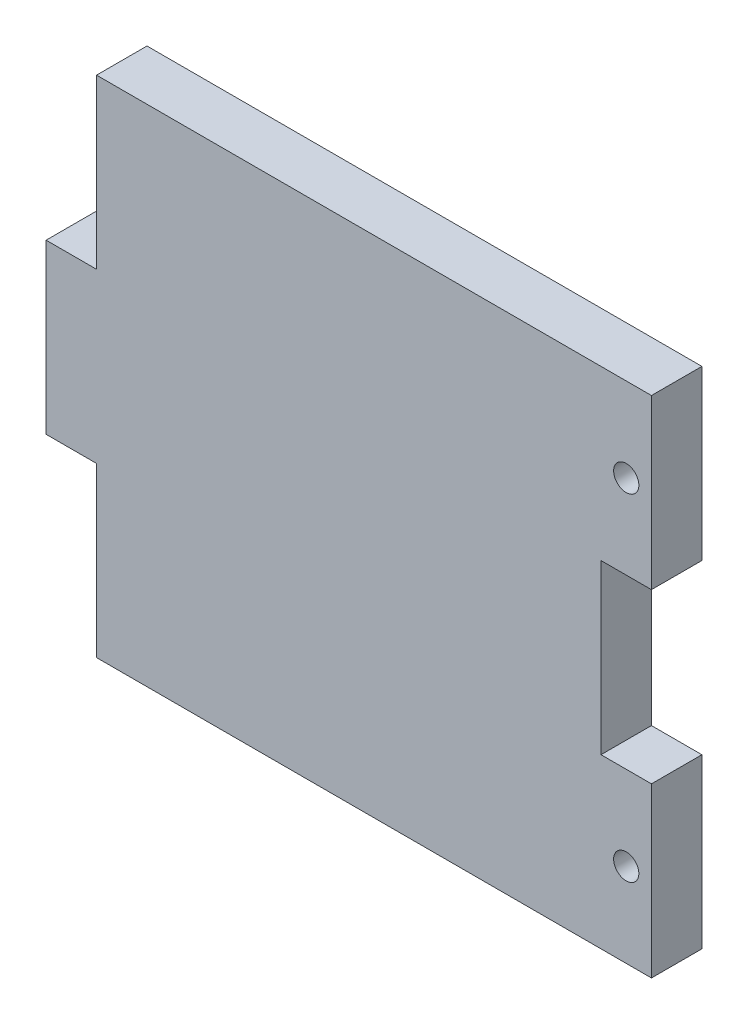
ISO-10303-21;
HEADER;
FILE_DESCRIPTION(('STEP AP214'),'2;1');
FILE_NAME('part.step','',(''),(''),'','','');
FILE_SCHEMA(('AUTOMOTIVE_DESIGN { 1 0 10303 214 1 1 1 1 }'));
ENDSEC;
DATA;
#1=APPLICATION_CONTEXT('core data for automotive mechanical design processes');
#2=APPLICATION_PROTOCOL_DEFINITION('international standard','automotive_design',2000,#1);
#3=PRODUCT_CONTEXT('',#1,'mechanical');
#4=PRODUCT('Part','Part','',(#3));
#5=PRODUCT_RELATED_PRODUCT_CATEGORY('part','',(#4));
#6=PRODUCT_DEFINITION_FORMATION('','',#4);
#7=PRODUCT_DEFINITION_CONTEXT('part definition',#1,'design');
#8=PRODUCT_DEFINITION('design','',#6,#7);
#9=PRODUCT_DEFINITION_SHAPE('','',#8);
#10=(LENGTH_UNIT() NAMED_UNIT(*) SI_UNIT(.MILLI.,.METRE.));
#11=(NAMED_UNIT(*) PLANE_ANGLE_UNIT() SI_UNIT($,.RADIAN.));
#12=(NAMED_UNIT(*) SI_UNIT($,.STERADIAN.) SOLID_ANGLE_UNIT());
#13=UNCERTAINTY_MEASURE_WITH_UNIT(LENGTH_MEASURE(1.E-05),#10,'distance_accuracy_value','');
#14=(GEOMETRIC_REPRESENTATION_CONTEXT(3) GLOBAL_UNCERTAINTY_ASSIGNED_CONTEXT((#13)) GLOBAL_UNIT_ASSIGNED_CONTEXT((#10,
#11,#12)) REPRESENTATION_CONTEXT('',''));
#15=CARTESIAN_POINT('',(0.,0.,0.));
#16=DIRECTION('',(0.,0.,1.));
#17=DIRECTION('',(1.,0.,0.));
#18=AXIS2_PLACEMENT_3D('',#15,#16,#17);
#19=CARTESIAN_POINT('',(0.,0.,6.));
#20=DIRECTION('',(-1.,0.,0.));
#21=DIRECTION('',(0.,-1.,0.));
#22=AXIS2_PLACEMENT_3D('',#19,#20,#21);
#23=PLANE('',#22);
#24=DIRECTION('',(0.,1.,0.));
#25=VECTOR('',#24,1.);
#26=CARTESIAN_POINT('',(0.,0.,0.));
#27=LINE('',#26,#25);
#28=CARTESIAN_POINT('',(0.,0.,0.));
#29=VERTEX_POINT('',#28);
#30=CARTESIAN_POINT('',(0.,20.,0.));
#31=VERTEX_POINT('',#30);
#32=EDGE_CURVE('E153',#29,#31,#27,.T.);
#33=ORIENTED_EDGE('',*,*,#32,.T.);
#34=DIRECTION('',(0.,0.,-1.));
#35=VECTOR('',#34,1.);
#36=CARTESIAN_POINT('',(0.,20.,6.));
#37=LINE('',#36,#35);
#38=CARTESIAN_POINT('',(0.,20.,6.));
#39=VERTEX_POINT('',#38);
#40=EDGE_CURVE('E11',#39,#31,#37,.T.);
#41=ORIENTED_EDGE('',*,*,#40,.F.);
#42=DIRECTION('',(0.,1.,0.));
#43=VECTOR('',#42,1.);
#44=CARTESIAN_POINT('',(0.,0.,6.));
#45=LINE('',#44,#43);
#46=CARTESIAN_POINT('',(0.,0.,6.));
#47=VERTEX_POINT('',#46);
#48=EDGE_CURVE('E176',#47,#39,#45,.T.);
#49=ORIENTED_EDGE('',*,*,#48,.F.);
#50=DIRECTION('',(0.,0.,-1.));
#51=VECTOR('',#50,1.);
#52=CARTESIAN_POINT('',(0.,0.,6.));
#53=LINE('',#52,#51);
#54=EDGE_CURVE('E149',#47,#29,#53,.T.);
#55=ORIENTED_EDGE('',*,*,#54,.T.);
#56=EDGE_LOOP('',(#33,#41,#49,#55));
#57=FACE_BOUND('',#56,.T.);
#58=ADVANCED_FACE('F33',(#57),#23,.F.);
#59=CARTESIAN_POINT('',(0.,20.,6.));
#60=DIRECTION('',(0.,-1.,0.));
#61=DIRECTION('',(1.,0.,0.));
#62=AXIS2_PLACEMENT_3D('',#59,#60,#61);
#63=PLANE('',#62);
#64=DIRECTION('',(-1.,0.,0.));
#65=VECTOR('',#64,1.);
#66=CARTESIAN_POINT('',(0.,20.,0.));
#67=LINE('',#66,#65);
#68=CARTESIAN_POINT('',(-6.,20.,0.));
#69=VERTEX_POINT('',#68);
#70=EDGE_CURVE('E156',#31,#69,#67,.T.);
#71=ORIENTED_EDGE('',*,*,#70,.T.);
#72=DIRECTION('',(0.,0.,-1.));
#73=VECTOR('',#72,1.);
#74=CARTESIAN_POINT('',(-6.,20.,6.));
#75=LINE('',#74,#73);
#76=CARTESIAN_POINT('',(-6.,20.,6.));
#77=VERTEX_POINT('',#76);
#78=EDGE_CURVE('E41',#77,#69,#75,.T.);
#79=ORIENTED_EDGE('',*,*,#78,.F.);
#80=DIRECTION('',(-1.,0.,0.));
#81=VECTOR('',#80,1.);
#82=CARTESIAN_POINT('',(0.,20.,6.));
#83=LINE('',#82,#81);
#84=EDGE_CURVE('E104',#39,#77,#83,.T.);
#85=ORIENTED_EDGE('',*,*,#84,.F.);
#86=ORIENTED_EDGE('',*,*,#40,.T.);
#87=EDGE_LOOP('',(#71,#79,#85,#86));
#88=FACE_BOUND('',#87,.T.);
#89=ADVANCED_FACE('F255',(#88),#63,.F.);
#90=CARTESIAN_POINT('',(-6.,40.,6.));
#91=DIRECTION('',(-1.,0.,0.));
#92=DIRECTION('',(0.,-1.,0.));
#93=AXIS2_PLACEMENT_3D('',#90,#91,#92);
#94=PLANE('',#93);
#95=DIRECTION('',(0.,1.,0.));
#96=VECTOR('',#95,1.);
#97=CARTESIAN_POINT('',(-6.,40.,0.));
#98=LINE('',#97,#96);
#99=CARTESIAN_POINT('',(-6.,40.,0.));
#100=VERTEX_POINT('',#99);
#101=EDGE_CURVE('E159',#69,#100,#98,.T.);
#102=ORIENTED_EDGE('',*,*,#101,.T.);
#103=DIRECTION('',(0.,0.,-1.));
#104=VECTOR('',#103,1.);
#105=CARTESIAN_POINT('',(-6.,40.,6.));
#106=LINE('',#105,#104);
#107=CARTESIAN_POINT('',(-6.,40.,6.));
#108=VERTEX_POINT('',#107);
#109=EDGE_CURVE('E195',#108,#100,#106,.T.);
#110=ORIENTED_EDGE('',*,*,#109,.F.);
#111=DIRECTION('',(0.,1.,0.));
#112=VECTOR('',#111,1.);
#113=CARTESIAN_POINT('',(-6.,40.,6.));
#114=LINE('',#113,#112);
#115=EDGE_CURVE('E203',#77,#108,#114,.T.);
#116=ORIENTED_EDGE('',*,*,#115,.F.);
#117=ORIENTED_EDGE('',*,*,#78,.T.);
#118=EDGE_LOOP('',(#102,#110,#116,#117));
#119=FACE_BOUND('',#118,.T.);
#120=ADVANCED_FACE('F201',(#119),#94,.F.);
#121=CARTESIAN_POINT('',(0.,40.,6.));
#122=DIRECTION('',(0.,1.,0.));
#123=DIRECTION('',(-1.,0.,0.));
#124=AXIS2_PLACEMENT_3D('',#121,#122,#123);
#125=PLANE('',#124);
#126=DIRECTION('',(1.,0.,0.));
#127=VECTOR('',#126,1.);
#128=CARTESIAN_POINT('',(0.,40.,0.));
#129=LINE('',#128,#127);
#130=CARTESIAN_POINT('',(0.,40.,0.));
#131=VERTEX_POINT('',#130);
#132=EDGE_CURVE('E161',#100,#131,#129,.T.);
#133=ORIENTED_EDGE('',*,*,#132,.T.);
#134=DIRECTION('',(0.,0.,-1.));
#135=VECTOR('',#134,1.);
#136=CARTESIAN_POINT('',(0.,40.,6.));
#137=LINE('',#136,#135);
#138=CARTESIAN_POINT('',(0.,40.,6.));
#139=VERTEX_POINT('',#138);
#140=EDGE_CURVE('E192',#139,#131,#137,.T.);
#141=ORIENTED_EDGE('',*,*,#140,.F.);
#142=DIRECTION('',(1.,0.,0.));
#143=VECTOR('',#142,1.);
#144=CARTESIAN_POINT('',(0.,40.,6.));
#145=LINE('',#144,#143);
#146=EDGE_CURVE('E221',#108,#139,#145,.T.);
#147=ORIENTED_EDGE('',*,*,#146,.F.);
#148=ORIENTED_EDGE('',*,*,#109,.T.);
#149=EDGE_LOOP('',(#133,#141,#147,#148));
#150=FACE_BOUND('',#149,.T.);
#151=ADVANCED_FACE('F212',(#150),#125,.F.);
#152=CARTESIAN_POINT('',(0.,40.,6.));
#153=DIRECTION('',(-1.,0.,0.));
#154=DIRECTION('',(0.,0.,1.));
#155=AXIS2_PLACEMENT_3D('',#152,#153,#154);
#156=PLANE('',#155);
#157=DIRECTION('',(0.,1.,0.));
#158=VECTOR('',#157,1.);
#159=CARTESIAN_POINT('',(0.,40.,0.));
#160=LINE('',#159,#158);
#161=CARTESIAN_POINT('',(0.,60.,0.));
#162=VERTEX_POINT('',#161);
#163=EDGE_CURVE('E163',#131,#162,#160,.T.);
#164=ORIENTED_EDGE('',*,*,#163,.T.);
#165=DIRECTION('',(0.,0.,-1.));
#166=VECTOR('',#165,1.);
#167=CARTESIAN_POINT('',(0.,60.,6.));
#168=LINE('',#167,#166);
#169=CARTESIAN_POINT('',(0.,60.,6.));
#170=VERTEX_POINT('',#169);
#171=EDGE_CURVE('E189',#170,#162,#168,.T.);
#172=ORIENTED_EDGE('',*,*,#171,.F.);
#173=DIRECTION('',(0.,1.,0.));
#174=VECTOR('',#173,1.);
#175=CARTESIAN_POINT('',(0.,40.,6.));
#176=LINE('',#175,#174);
#177=EDGE_CURVE('E218',#139,#170,#176,.T.);
#178=ORIENTED_EDGE('',*,*,#177,.F.);
#179=ORIENTED_EDGE('',*,*,#140,.T.);
#180=EDGE_LOOP('',(#164,#172,#178,#179));
#181=FACE_BOUND('',#180,.T.);
#182=ADVANCED_FACE('F216',(#181),#156,.F.);
#183=CARTESIAN_POINT('',(0.,60.,6.));
#184=DIRECTION('',(0.,-1.,0.));
#185=DIRECTION('',(1.,0.,0.));
#186=AXIS2_PLACEMENT_3D('',#183,#184,#185);
#187=PLANE('',#186);
#188=DIRECTION('',(-1.,0.,0.));
#189=VECTOR('',#188,1.);
#190=CARTESIAN_POINT('',(0.,60.,0.));
#191=LINE('',#190,#189);
#192=CARTESIAN_POINT('',(-66.,60.,0.));
#193=VERTEX_POINT('',#192);
#194=EDGE_CURVE('E165',#162,#193,#191,.T.);
#195=ORIENTED_EDGE('',*,*,#194,.T.);
#196=DIRECTION('',(0.,0.,-1.));
#197=VECTOR('',#196,1.);
#198=CARTESIAN_POINT('',(-66.,60.,6.));
#199=LINE('',#198,#197);
#200=CARTESIAN_POINT('',(-66.,60.,6.));
#201=VERTEX_POINT('',#200);
#202=EDGE_CURVE('E186',#201,#193,#199,.T.);
#203=ORIENTED_EDGE('',*,*,#202,.F.);
#204=DIRECTION('',(-1.,0.,0.));
#205=VECTOR('',#204,1.);
#206=CARTESIAN_POINT('',(0.,60.,6.));
#207=LINE('',#206,#205);
#208=EDGE_CURVE('E220',#170,#201,#207,.T.);
#209=ORIENTED_EDGE('',*,*,#208,.F.);
#210=ORIENTED_EDGE('',*,*,#171,.T.);
#211=EDGE_LOOP('',(#195,#203,#209,#210));
#212=FACE_BOUND('',#211,.T.);
#213=ADVANCED_FACE('F268',(#212),#187,.F.);
#214=CARTESIAN_POINT('',(-66.,40.,6.));
#215=DIRECTION('',(1.,0.,0.));
#216=DIRECTION('',(0.,0.,-1.));
#217=AXIS2_PLACEMENT_3D('',#214,#215,#216);
#218=PLANE('',#217);
#219=DIRECTION('',(0.,-1.,0.));
#220=VECTOR('',#219,1.);
#221=CARTESIAN_POINT('',(-66.,40.,0.));
#222=LINE('',#221,#220);
#223=CARTESIAN_POINT('',(-66.,40.,0.));
#224=VERTEX_POINT('',#223);
#225=EDGE_CURVE('E167',#193,#224,#222,.T.);
#226=ORIENTED_EDGE('',*,*,#225,.T.);
#227=DIRECTION('',(0.,0.,-1.));
#228=VECTOR('',#227,1.);
#229=CARTESIAN_POINT('',(-66.,40.,6.));
#230=LINE('',#229,#228);
#231=CARTESIAN_POINT('',(-66.,40.,6.));
#232=VERTEX_POINT('',#231);
#233=EDGE_CURVE('E183',#232,#224,#230,.T.);
#234=ORIENTED_EDGE('',*,*,#233,.F.);
#235=DIRECTION('',(0.,-1.,0.));
#236=VECTOR('',#235,1.);
#237=CARTESIAN_POINT('',(-66.,40.,6.));
#238=LINE('',#237,#236);
#239=EDGE_CURVE('E223',#201,#232,#238,.T.);
#240=ORIENTED_EDGE('',*,*,#239,.F.);
#241=ORIENTED_EDGE('',*,*,#202,.T.);
#242=EDGE_LOOP('',(#226,#234,#240,#241));
#243=FACE_BOUND('',#242,.T.);
#244=ADVANCED_FACE('F271',(#243),#218,.F.);
#245=CARTESIAN_POINT('',(-66.,40.,6.));
#246=DIRECTION('',(0.,-1.,0.));
#247=DIRECTION('',(0.,0.,-1.));
#248=AXIS2_PLACEMENT_3D('',#245,#246,#247);
#249=PLANE('',#248);
#250=DIRECTION('',(-1.,0.,0.));
#251=VECTOR('',#250,1.);
#252=CARTESIAN_POINT('',(-66.,40.,0.));
#253=LINE('',#252,#251);
#254=CARTESIAN_POINT('',(-72.,40.,0.));
#255=VERTEX_POINT('',#254);
#256=EDGE_CURVE('E169',#224,#255,#253,.T.);
#257=ORIENTED_EDGE('',*,*,#256,.T.);
#258=DIRECTION('',(0.,0.,-1.));
#259=VECTOR('',#258,1.);
#260=CARTESIAN_POINT('',(-72.,40.,6.));
#261=LINE('',#260,#259);
#262=CARTESIAN_POINT('',(-72.,40.,6.));
#263=VERTEX_POINT('',#262);
#264=EDGE_CURVE('E180',#263,#255,#261,.T.);
#265=ORIENTED_EDGE('',*,*,#264,.F.);
#266=DIRECTION('',(-1.,0.,0.));
#267=VECTOR('',#266,1.);
#268=CARTESIAN_POINT('',(-66.,40.,6.));
#269=LINE('',#268,#267);
#270=EDGE_CURVE('E229',#232,#263,#269,.T.);
#271=ORIENTED_EDGE('',*,*,#270,.F.);
#272=ORIENTED_EDGE('',*,*,#233,.T.);
#273=EDGE_LOOP('',(#257,#265,#271,#272));
#274=FACE_BOUND('',#273,.T.);
#275=ADVANCED_FACE('F235',(#274),#249,.F.);
#276=CARTESIAN_POINT('',(-72.,40.,6.));
#277=DIRECTION('',(1.,0.,0.));
#278=DIRECTION('',(0.,0.,-1.));
#279=AXIS2_PLACEMENT_3D('',#276,#277,#278);
#280=PLANE('',#279);
#281=DIRECTION('',(0.,-1.,0.));
#282=VECTOR('',#281,1.);
#283=CARTESIAN_POINT('',(-72.,40.,0.));
#284=LINE('',#283,#282);
#285=CARTESIAN_POINT('',(-72.,20.,0.));
#286=VERTEX_POINT('',#285);
#287=EDGE_CURVE('E171',#255,#286,#284,.T.);
#288=ORIENTED_EDGE('',*,*,#287,.T.);
#289=DIRECTION('',(0.,0.,-1.));
#290=VECTOR('',#289,1.);
#291=CARTESIAN_POINT('',(-72.,20.,6.));
#292=LINE('',#291,#290);
#293=CARTESIAN_POINT('',(-72.,20.,6.));
#294=VERTEX_POINT('',#293);
#295=EDGE_CURVE('E144',#294,#286,#292,.T.);
#296=ORIENTED_EDGE('',*,*,#295,.F.);
#297=DIRECTION('',(0.,-1.,0.));
#298=VECTOR('',#297,1.);
#299=CARTESIAN_POINT('',(-72.,40.,6.));
#300=LINE('',#299,#298);
#301=EDGE_CURVE('E135',#263,#294,#300,.T.);
#302=ORIENTED_EDGE('',*,*,#301,.F.);
#303=ORIENTED_EDGE('',*,*,#264,.T.);
#304=EDGE_LOOP('',(#288,#296,#302,#303));
#305=FACE_BOUND('',#304,.T.);
#306=ADVANCED_FACE('F239',(#305),#280,.F.);
#307=CARTESIAN_POINT('',(-66.,20.,6.));
#308=DIRECTION('',(0.,1.,0.));
#309=DIRECTION('',(0.,0.,1.));
#310=AXIS2_PLACEMENT_3D('',#307,#308,#309);
#311=PLANE('',#310);
#312=DIRECTION('',(1.,0.,0.));
#313=VECTOR('',#312,1.);
#314=CARTESIAN_POINT('',(-66.,20.,0.));
#315=LINE('',#314,#313);
#316=CARTESIAN_POINT('',(-66.,20.,0.));
#317=VERTEX_POINT('',#316);
#318=EDGE_CURVE('E143',#286,#317,#315,.T.);
#319=ORIENTED_EDGE('',*,*,#318,.T.);
#320=DIRECTION('',(0.,0.,-1.));
#321=VECTOR('',#320,1.);
#322=CARTESIAN_POINT('',(-66.,20.,6.));
#323=LINE('',#322,#321);
#324=CARTESIAN_POINT('',(-66.,20.,6.));
#325=VERTEX_POINT('',#324);
#326=EDGE_CURVE('E140',#325,#317,#323,.T.);
#327=ORIENTED_EDGE('',*,*,#326,.F.);
#328=DIRECTION('',(1.,0.,0.));
#329=VECTOR('',#328,1.);
#330=CARTESIAN_POINT('',(-66.,20.,6.));
#331=LINE('',#330,#329);
#332=EDGE_CURVE('E129',#294,#325,#331,.T.);
#333=ORIENTED_EDGE('',*,*,#332,.F.);
#334=ORIENTED_EDGE('',*,*,#295,.T.);
#335=EDGE_LOOP('',(#319,#327,#333,#334));
#336=FACE_BOUND('',#335,.T.);
#337=ADVANCED_FACE('F141',(#336),#311,.F.);
#338=CARTESIAN_POINT('',(-66.,0.,6.));
#339=DIRECTION('',(1.,0.,0.));
#340=DIRECTION('',(0.,0.,-1.));
#341=AXIS2_PLACEMENT_3D('',#338,#339,#340);
#342=PLANE('',#341);
#343=DIRECTION('',(0.,-1.,0.));
#344=VECTOR('',#343,1.);
#345=CARTESIAN_POINT('',(-66.,0.,0.));
#346=LINE('',#345,#344);
#347=CARTESIAN_POINT('',(-66.,0.,0.));
#348=VERTEX_POINT('',#347);
#349=EDGE_CURVE('E90',#317,#348,#346,.T.);
#350=ORIENTED_EDGE('',*,*,#349,.T.);
#351=DIRECTION('',(0.,0.,-1.));
#352=VECTOR('',#351,1.);
#353=CARTESIAN_POINT('',(-66.,0.,6.));
#354=LINE('',#353,#352);
#355=CARTESIAN_POINT('',(-66.,0.,6.));
#356=VERTEX_POINT('',#355);
#357=EDGE_CURVE('E145',#356,#348,#354,.T.);
#358=ORIENTED_EDGE('',*,*,#357,.F.);
#359=DIRECTION('',(0.,-1.,0.));
#360=VECTOR('',#359,1.);
#361=CARTESIAN_POINT('',(-66.,0.,6.));
#362=LINE('',#361,#360);
#363=EDGE_CURVE('E133',#325,#356,#362,.T.);
#364=ORIENTED_EDGE('',*,*,#363,.F.);
#365=ORIENTED_EDGE('',*,*,#326,.T.);
#366=EDGE_LOOP('',(#350,#358,#364,#365));
#367=FACE_BOUND('',#366,.T.);
#368=ADVANCED_FACE('F147',(#367),#342,.F.);
#369=CARTESIAN_POINT('',(0.,0.,6.));
#370=DIRECTION('',(0.,1.,0.));
#371=DIRECTION('',(-1.,0.,0.));
#372=AXIS2_PLACEMENT_3D('',#369,#370,#371);
#373=PLANE('',#372);
#374=DIRECTION('',(1.,0.,0.));
#375=VECTOR('',#374,1.);
#376=CARTESIAN_POINT('',(0.,0.,0.));
#377=LINE('',#376,#375);
#378=EDGE_CURVE('E96',#348,#29,#377,.T.);
#379=ORIENTED_EDGE('',*,*,#378,.T.);
#380=ORIENTED_EDGE('',*,*,#54,.F.);
#381=DIRECTION('',(1.,0.,0.));
#382=VECTOR('',#381,1.);
#383=CARTESIAN_POINT('',(0.,0.,6.));
#384=LINE('',#383,#382);
#385=EDGE_CURVE('E49',#356,#47,#384,.T.);
#386=ORIENTED_EDGE('',*,*,#385,.F.);
#387=ORIENTED_EDGE('',*,*,#357,.T.);
#388=EDGE_LOOP('',(#379,#380,#386,#387));
#389=FACE_BOUND('',#388,.T.);
#390=ADVANCED_FACE('F243',(#389),#373,.F.);
#391=CARTESIAN_POINT('',(0.,0.,6.));
#392=DIRECTION('',(0.,0.,1.));
#393=DIRECTION('',(1.,0.,0.));
#394=AXIS2_PLACEMENT_3D('',#391,#392,#393);
#395=PLANE('',#394);
#396=CARTESIAN_POINT('',(-3.,9.99999999999998,6.));
#397=DIRECTION('',(0.,0.,-1.));
#398=DIRECTION('',(-1.,0.,0.));
#399=AXIS2_PLACEMENT_3D('',#396,#397,#398);
#400=CIRCLE('',#399,1.5);
#401=CARTESIAN_POINT('',(-4.5,9.99999999999998,6.));
#402=VERTEX_POINT('',#401);
#403=EDGE_CURVE('E334',#402,#402,#400,.T.);
#404=ORIENTED_EDGE('',*,*,#403,.T.);
#405=EDGE_LOOP('',(#404));
#406=FACE_BOUND('',#405,.T.);
#407=CARTESIAN_POINT('',(-3.,50.,6.));
#408=DIRECTION('',(0.,0.,-1.));
#409=DIRECTION('',(1.,0.,0.));
#410=AXIS2_PLACEMENT_3D('',#407,#408,#409);
#411=CIRCLE('',#410,1.5);
#412=CARTESIAN_POINT('',(-1.5,50.,6.));
#413=VERTEX_POINT('',#412);
#414=EDGE_CURVE('E157',#413,#413,#411,.T.);
#415=ORIENTED_EDGE('',*,*,#414,.T.);
#416=EDGE_LOOP('',(#415));
#417=FACE_BOUND('',#416,.T.);
#418=ORIENTED_EDGE('',*,*,#48,.T.);
#419=ORIENTED_EDGE('',*,*,#84,.T.);
#420=ORIENTED_EDGE('',*,*,#115,.T.);
#421=ORIENTED_EDGE('',*,*,#146,.T.);
#422=ORIENTED_EDGE('',*,*,#177,.T.);
#423=ORIENTED_EDGE('',*,*,#208,.T.);
#424=ORIENTED_EDGE('',*,*,#239,.T.);
#425=ORIENTED_EDGE('',*,*,#270,.T.);
#426=ORIENTED_EDGE('',*,*,#301,.T.);
#427=ORIENTED_EDGE('',*,*,#332,.T.);
#428=ORIENTED_EDGE('',*,*,#363,.T.);
#429=ORIENTED_EDGE('',*,*,#385,.T.);
#430=EDGE_LOOP('',(#418,#419,#420,#421,#422,#423,#424,#425,#426,#427,#428,#429));
#431=FACE_BOUND('',#430,.T.);
#432=ADVANCED_FACE('F131',(#406,#417,#431),#395,.T.);
#433=CARTESIAN_POINT('',(0.,0.,0.));
#434=DIRECTION('',(0.,0.,1.));
#435=DIRECTION('',(1.,0.,0.));
#436=AXIS2_PLACEMENT_3D('',#433,#434,#435);
#437=PLANE('',#436);
#438=CARTESIAN_POINT('',(-3.,9.99999999999998,0.));
#439=DIRECTION('',(0.,0.,-1.));
#440=DIRECTION('',(-1.,0.,0.));
#441=AXIS2_PLACEMENT_3D('',#438,#439,#440);
#442=CIRCLE('',#441,1.5);
#443=CARTESIAN_POINT('',(-4.5,9.99999999999998,0.));
#444=VERTEX_POINT('',#443);
#445=EDGE_CURVE('E337',#444,#444,#442,.T.);
#446=ORIENTED_EDGE('',*,*,#445,.F.);
#447=EDGE_LOOP('',(#446));
#448=FACE_BOUND('',#447,.T.);
#449=CARTESIAN_POINT('',(-3.,50.,0.));
#450=DIRECTION('',(0.,0.,-1.));
#451=DIRECTION('',(1.,0.,0.));
#452=AXIS2_PLACEMENT_3D('',#449,#450,#451);
#453=CIRCLE('',#452,1.5);
#454=CARTESIAN_POINT('',(-1.5,50.,0.));
#455=VERTEX_POINT('',#454);
#456=EDGE_CURVE('E339',#455,#455,#453,.T.);
#457=ORIENTED_EDGE('',*,*,#456,.F.);
#458=EDGE_LOOP('',(#457));
#459=FACE_BOUND('',#458,.T.);
#460=ORIENTED_EDGE('',*,*,#32,.F.);
#461=ORIENTED_EDGE('',*,*,#378,.F.);
#462=ORIENTED_EDGE('',*,*,#349,.F.);
#463=ORIENTED_EDGE('',*,*,#318,.F.);
#464=ORIENTED_EDGE('',*,*,#287,.F.);
#465=ORIENTED_EDGE('',*,*,#256,.F.);
#466=ORIENTED_EDGE('',*,*,#225,.F.);
#467=ORIENTED_EDGE('',*,*,#194,.F.);
#468=ORIENTED_EDGE('',*,*,#163,.F.);
#469=ORIENTED_EDGE('',*,*,#132,.F.);
#470=ORIENTED_EDGE('',*,*,#101,.F.);
#471=ORIENTED_EDGE('',*,*,#70,.F.);
#472=EDGE_LOOP('',(#460,#461,#462,#463,#464,#465,#466,#467,#468,#469,#470,#471));
#473=FACE_BOUND('',#472,.T.);
#474=ADVANCED_FACE('F207',(#448,#459,#473),#437,.F.);
#475=CARTESIAN_POINT('',(-3.,50.,6.));
#476=DIRECTION('',(0.,0.,-1.));
#477=DIRECTION('',(-1.,0.,0.));
#478=AXIS2_PLACEMENT_3D('',#475,#476,#477);
#479=CYLINDRICAL_SURFACE('',#478,1.5);
#480=ORIENTED_EDGE('',*,*,#414,.F.);
#481=EDGE_LOOP('',(#480));
#482=FACE_BOUND('',#481,.T.);
#483=ORIENTED_EDGE('',*,*,#456,.T.);
#484=EDGE_LOOP('',(#483));
#485=FACE_BOUND('',#484,.T.);
#486=ADVANCED_FACE('F308',(#482,#485),#479,.F.);
#487=CARTESIAN_POINT('',(-3.,9.99999999999998,6.));
#488=DIRECTION('',(0.,0.,-1.));
#489=DIRECTION('',(-1.,0.,0.));
#490=AXIS2_PLACEMENT_3D('',#487,#488,#489);
#491=CYLINDRICAL_SURFACE('',#490,1.5);
#492=ORIENTED_EDGE('',*,*,#403,.F.);
#493=EDGE_LOOP('',(#492));
#494=FACE_BOUND('',#493,.T.);
#495=ORIENTED_EDGE('',*,*,#445,.T.);
#496=EDGE_LOOP('',(#495));
#497=FACE_BOUND('',#496,.T.);
#498=ADVANCED_FACE('F317',(#494,#497),#491,.F.);
#499=CLOSED_SHELL('',(#58,#89,#120,#151,#182,#213,#244,#275,#306,#337,#368,#390,#432,#474,#486,#498));
#500=MANIFOLD_SOLID_BREP('B2',#499);
#501=ADVANCED_BREP_SHAPE_REPRESENTATION('',(#18,#500),#14);
#502=SHAPE_DEFINITION_REPRESENTATION(#9,#501);
ENDSEC;
END-ISO-10303-21;
